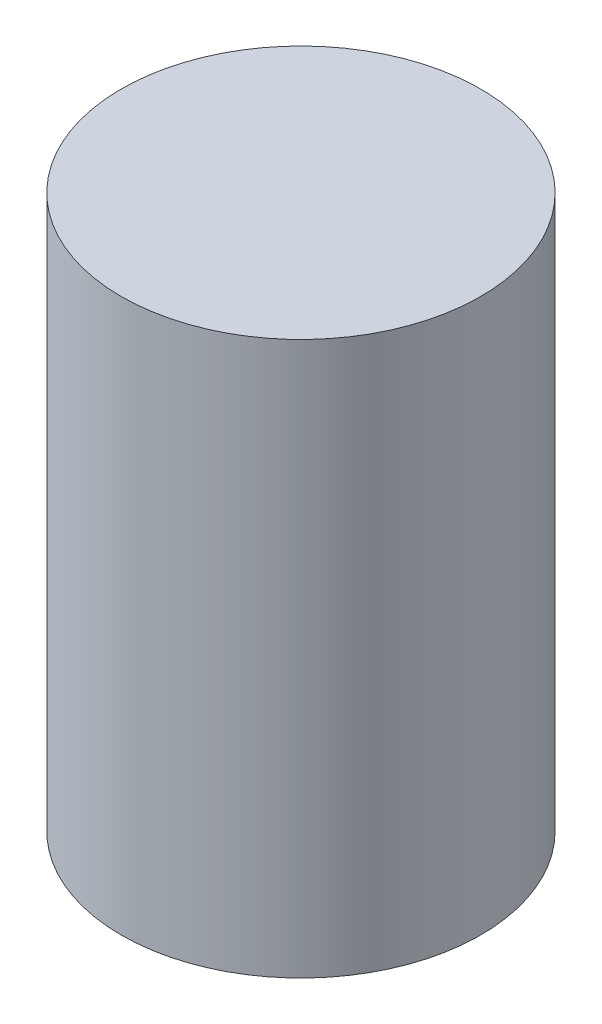
ISO-10303-21;
HEADER;
FILE_DESCRIPTION(('STEP AP214'),'2;1');
FILE_NAME('part.step','',(''),(''),'','','');
FILE_SCHEMA(('AUTOMOTIVE_DESIGN { 1 0 10303 214 1 1 1 1 }'));
ENDSEC;
DATA;
#1=APPLICATION_CONTEXT('core data for automotive mechanical design processes');
#2=APPLICATION_PROTOCOL_DEFINITION('international standard','automotive_design',2000,#1);
#3=PRODUCT_CONTEXT('',#1,'mechanical');
#4=PRODUCT('Part','Part','',(#3));
#5=PRODUCT_RELATED_PRODUCT_CATEGORY('part','',(#4));
#6=PRODUCT_DEFINITION_FORMATION('','',#4);
#7=PRODUCT_DEFINITION_CONTEXT('part definition',#1,'design');
#8=PRODUCT_DEFINITION('design','',#6,#7);
#9=PRODUCT_DEFINITION_SHAPE('','',#8);
#10=(LENGTH_UNIT() NAMED_UNIT(*) SI_UNIT(.MILLI.,.METRE.));
#11=(NAMED_UNIT(*) PLANE_ANGLE_UNIT() SI_UNIT($,.RADIAN.));
#12=(NAMED_UNIT(*) SI_UNIT($,.STERADIAN.) SOLID_ANGLE_UNIT());
#13=UNCERTAINTY_MEASURE_WITH_UNIT(LENGTH_MEASURE(1.E-05),#10,'distance_accuracy_value','');
#14=(GEOMETRIC_REPRESENTATION_CONTEXT(3) GLOBAL_UNCERTAINTY_ASSIGNED_CONTEXT((#13)) GLOBAL_UNIT_ASSIGNED_CONTEXT((#10,
#11,#12)) REPRESENTATION_CONTEXT('',''));
#15=CARTESIAN_POINT('',(0.,0.,0.));
#16=DIRECTION('',(0.,0.,1.));
#17=DIRECTION('',(1.,0.,0.));
#18=AXIS2_PLACEMENT_3D('',#15,#16,#17);
#19=CARTESIAN_POINT('',(0.,4.,0.));
#20=DIRECTION('',(0.,-1.,0.));
#21=DIRECTION('',(0.,0.,-1.));
#22=AXIS2_PLACEMENT_3D('',#19,#20,#21);
#23=CYLINDRICAL_SURFACE('',#22,1.3);
#24=CARTESIAN_POINT('',(0.,4.,0.));
#25=DIRECTION('',(0.,1.,0.));
#26=DIRECTION('',(0.,0.,1.));
#27=AXIS2_PLACEMENT_3D('',#24,#25,#26);
#28=CIRCLE('',#27,1.3);
#29=CARTESIAN_POINT('',(0.,4.,1.3));
#30=VERTEX_POINT('',#29);
#31=EDGE_CURVE('E10',#30,#30,#28,.T.);
#32=ORIENTED_EDGE('',*,*,#31,.F.);
#33=EDGE_LOOP('',(#32));
#34=FACE_BOUND('',#33,.T.);
#35=CARTESIAN_POINT('',(0.,0.,0.));
#36=DIRECTION('',(0.,1.,0.));
#37=DIRECTION('',(0.,0.,1.));
#38=AXIS2_PLACEMENT_3D('',#35,#36,#37);
#39=CIRCLE('',#38,1.3);
#40=CARTESIAN_POINT('',(0.,0.,1.3));
#41=VERTEX_POINT('',#40);
#42=EDGE_CURVE('E46',#41,#41,#39,.T.);
#43=ORIENTED_EDGE('',*,*,#42,.T.);
#44=EDGE_LOOP('',(#43));
#45=FACE_BOUND('',#44,.T.);
#46=ADVANCED_FACE('F43',(#34,#45),#23,.T.);
#47=CARTESIAN_POINT('',(0.,4.,0.));
#48=DIRECTION('',(0.,1.,0.));
#49=DIRECTION('',(0.,0.,1.));
#50=AXIS2_PLACEMENT_3D('',#47,#48,#49);
#51=PLANE('',#50);
#52=ORIENTED_EDGE('',*,*,#31,.T.);
#53=EDGE_LOOP('',(#52));
#54=FACE_BOUND('',#53,.T.);
#55=ADVANCED_FACE('F60',(#54),#51,.T.);
#56=CARTESIAN_POINT('',(0.,0.,0.));
#57=DIRECTION('',(0.,1.,0.));
#58=DIRECTION('',(0.,0.,1.));
#59=AXIS2_PLACEMENT_3D('',#56,#57,#58);
#60=PLANE('',#59);
#61=ORIENTED_EDGE('',*,*,#42,.F.);
#62=EDGE_LOOP('',(#61));
#63=FACE_BOUND('',#62,.T.);
#64=ADVANCED_FACE('F58',(#63),#60,.F.);
#65=CLOSED_SHELL('',(#46,#55,#64));
#66=MANIFOLD_SOLID_BREP('B2',#65);
#67=ADVANCED_BREP_SHAPE_REPRESENTATION('',(#18,#66),#14);
#68=SHAPE_DEFINITION_REPRESENTATION(#9,#67);
ENDSEC;
END-ISO-10303-21;
